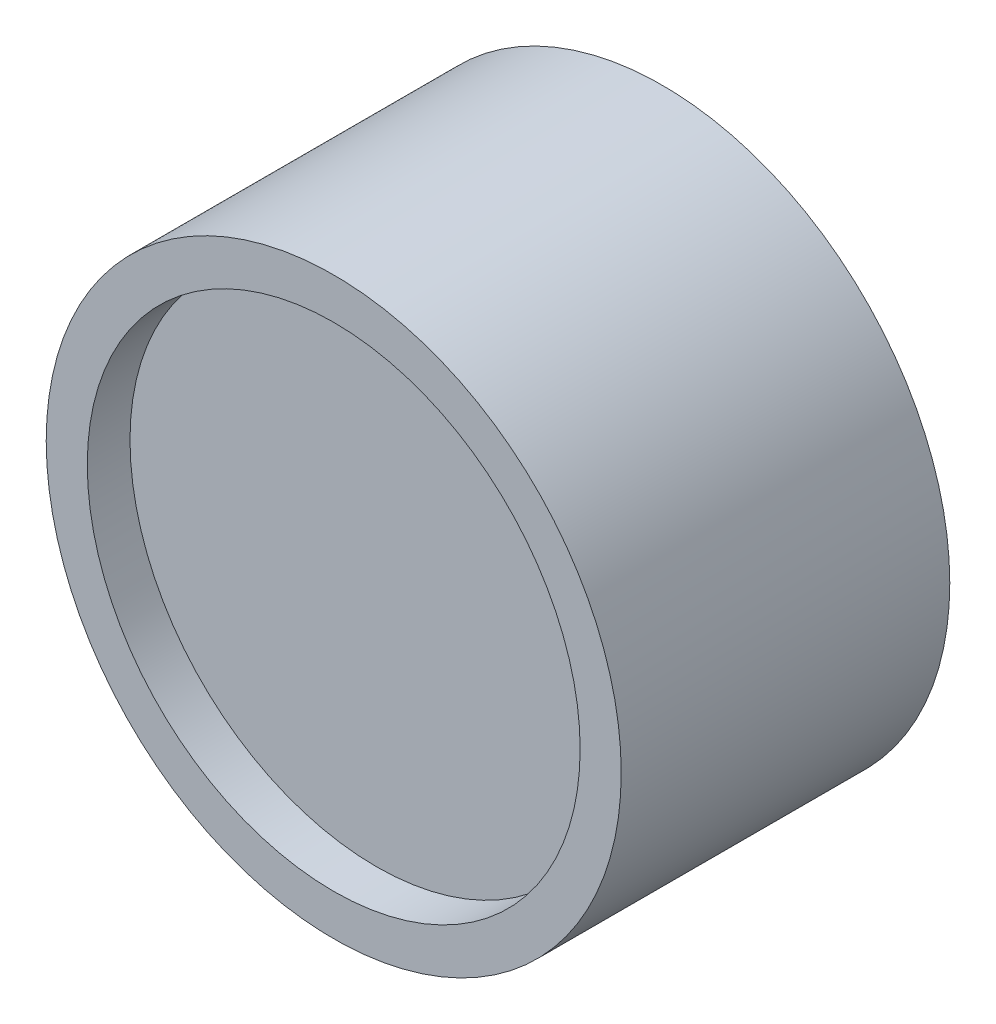
ISO-10303-21;
HEADER;
FILE_DESCRIPTION(('STEP AP214'),'2;1');
FILE_NAME('part.step','',(''),(''),'','','');
FILE_SCHEMA(('AUTOMOTIVE_DESIGN { 1 0 10303 214 1 1 1 1 }'));
ENDSEC;
DATA;
#1=APPLICATION_CONTEXT('core data for automotive mechanical design processes');
#2=APPLICATION_PROTOCOL_DEFINITION('international standard','automotive_design',2000,#1);
#3=PRODUCT_CONTEXT('',#1,'mechanical');
#4=PRODUCT('Part','Part','',(#3));
#5=PRODUCT_RELATED_PRODUCT_CATEGORY('part','',(#4));
#6=PRODUCT_DEFINITION_FORMATION('','',#4);
#7=PRODUCT_DEFINITION_CONTEXT('part definition',#1,'design');
#8=PRODUCT_DEFINITION('design','',#6,#7);
#9=PRODUCT_DEFINITION_SHAPE('','',#8);
#10=(LENGTH_UNIT() NAMED_UNIT(*) SI_UNIT(.MILLI.,.METRE.));
#11=(NAMED_UNIT(*) PLANE_ANGLE_UNIT() SI_UNIT($,.RADIAN.));
#12=(NAMED_UNIT(*) SI_UNIT($,.STERADIAN.) SOLID_ANGLE_UNIT());
#13=UNCERTAINTY_MEASURE_WITH_UNIT(LENGTH_MEASURE(1.E-05),#10,'distance_accuracy_value','');
#14=(GEOMETRIC_REPRESENTATION_CONTEXT(3) GLOBAL_UNCERTAINTY_ASSIGNED_CONTEXT((#13)) GLOBAL_UNIT_ASSIGNED_CONTEXT((#10,
#11,#12)) REPRESENTATION_CONTEXT('',''));
#15=CARTESIAN_POINT('',(0.,0.,0.));
#16=DIRECTION('',(0.,0.,1.));
#17=DIRECTION('',(1.,0.,0.));
#18=AXIS2_PLACEMENT_3D('',#15,#16,#17);
#19=CARTESIAN_POINT('',(0.,0.,25.4));
#20=DIRECTION('',(0.,0.,-1.));
#21=DIRECTION('',(-1.,0.,0.));
#22=AXIS2_PLACEMENT_3D('',#19,#20,#21);
#23=CYLINDRICAL_SURFACE('',#22,22.225);
#24=CARTESIAN_POINT('',(0.,-22.225,11.1125));
#25=CARTESIAN_POINT('',(-0.0890487798453095,-22.2249992505102,11.1125039073543));
#26=CARTESIAN_POINT('',(-0.178159230469294,-22.2244590967661,11.1200178035833));
#27=CARTESIAN_POINT('',(-0.353917635489171,-22.2223562476493,11.1498832780774));
#28=CARTESIAN_POINT('',(-0.440562633778052,-22.2207923746226,11.1722519452273));
#29=CARTESIAN_POINT('',(-0.608818958371995,-22.2168189279091,11.2311794705406));
#30=CARTESIAN_POINT('',(-0.690432988297744,-22.2144098131927,11.2677306286791));
#31=CARTESIAN_POINT('',(-0.846346733612161,-22.209016530152,11.3539725754268));
#32=CARTESIAN_POINT('',(-0.92064807541319,-22.2060324901352,11.4036604332036));
#33=CARTESIAN_POINT('',(-1.05998999170469,-22.1998181704503,11.5148686586035));
#34=CARTESIAN_POINT('',(-1.12501469630088,-22.1965874829864,11.576408889821));
#35=CARTESIAN_POINT('',(-1.24382158914945,-22.1902474420535,11.7095334825911));
#36=CARTESIAN_POINT('',(-1.29760329834655,-22.1871380937593,11.7811182719174));
#37=CARTESIAN_POINT('',(-1.39244884206195,-22.1813881326419,11.9323929227927));
#38=CARTESIAN_POINT('',(-1.4334991146123,-22.1787480209346,12.0120913080482));
#39=CARTESIAN_POINT('',(-1.50162982074141,-22.1742396816116,12.1772712016783));
#40=CARTESIAN_POINT('',(-1.52871044238853,-22.1723714436044,12.2627526321803));
#41=CARTESIAN_POINT('',(-1.56808808720031,-22.1696215072539,12.4369160956109));
#42=CARTESIAN_POINT('',(-1.5804104784373,-22.1687381162285,12.5255923657623));
#43=CARTESIAN_POINT('',(-1.59000021081584,-22.1680524315257,12.7037586920349));
#44=CARTESIAN_POINT('',(-1.58726776650483,-22.1682501224418,12.7932487365407));
#45=CARTESIAN_POINT('',(-1.56684640404739,-22.1697027374792,12.9703290753081));
#46=CARTESIAN_POINT('',(-1.54918498269757,-22.1709557179102,13.0579225587361));
#47=CARTESIAN_POINT('',(-1.49944968680589,-22.1743746638034,13.2288985347794));
#48=CARTESIAN_POINT('',(-1.46737570439987,-22.1765406360985,13.312280995874));
#49=CARTESIAN_POINT('',(-1.38969470144194,-22.1815437306027,13.4725560714156));
#50=CARTESIAN_POINT('',(-1.34407526138189,-22.1843814682512,13.5494426464724));
#51=CARTESIAN_POINT('',(-1.24060729011335,-22.1904077269116,13.694477391925));
#52=CARTESIAN_POINT('',(-1.18275857799096,-22.1935962531125,13.7626254330231));
#53=CARTESIAN_POINT('',(-1.0563195629451,-22.1999734282712,13.888408577817));
#54=CARTESIAN_POINT('',(-0.987705473474702,-22.2031620614841,13.9460197744466));
#55=CARTESIAN_POINT('',(-0.841766632911357,-22.2091732949878,14.0489092827639));
#56=CARTESIAN_POINT('',(-0.764441877818134,-22.2119958951105,14.0941875887878));
#57=CARTESIAN_POINT('',(-0.60326175991087,-22.2169573533996,14.1711242196128));
#58=CARTESIAN_POINT('',(-0.51940593447263,-22.2190961630752,14.2027815785446));
#59=CARTESIAN_POINT('',(-0.347550767268375,-22.2224484329266,14.2515614076498));
#60=CARTESIAN_POINT('',(-0.259551488702717,-22.2236619072117,14.2686840994457));
#61=CARTESIAN_POINT('',(-0.0821147353008575,-22.225024960202,14.2878787828138));
#62=CARTESIAN_POINT('',(0.00731914806021066,-22.2251768744895,14.2899838155781));
#63=CARTESIAN_POINT('',(0.185268660784768,-22.2244059124829,14.279169846819));
#64=CARTESIAN_POINT('',(0.273784296409173,-22.2234830435218,14.2662509478017));
#65=CARTESIAN_POINT('',(0.447291156480126,-22.2206678673679,14.225783204566));
#66=CARTESIAN_POINT('',(0.532285948667428,-22.2187765688341,14.1982495810901));
#67=CARTESIAN_POINT('',(0.696448708516854,-22.2142371838267,14.1293494594617));
#68=CARTESIAN_POINT('',(0.7756166079563,-22.211589088494,14.08798279938));
#69=CARTESIAN_POINT('',(0.926029235370731,-22.2058275571246,13.9925071647473));
#70=CARTESIAN_POINT('',(0.997259969190536,-22.2027133211846,13.938376192758));
#71=CARTESIAN_POINT('',(1.12963525884952,-22.1963724429854,13.818940436154));
#72=CARTESIAN_POINT('',(1.19077968566527,-22.1931457992889,13.7536355086244));
#73=CARTESIAN_POINT('',(1.30135918063973,-22.1869369396489,13.6135627265823));
#74=CARTESIAN_POINT('',(1.35077276342894,-22.1839551786465,13.538777887661));
#75=CARTESIAN_POINT('',(1.4363407997941,-22.1785796677168,13.3819531818253));
#76=CARTESIAN_POINT('',(1.47249535528282,-22.1761859132699,13.2999133706808));
#77=CARTESIAN_POINT('',(1.530482072823,-22.1722596801863,13.1309850595532));
#78=CARTESIAN_POINT('',(1.55232761141387,-22.1707263973451,13.0441011706787));
#79=CARTESIAN_POINT('',(1.58111981510363,-22.1686918130773,12.8678873304204));
#80=CARTESIAN_POINT('',(1.58806668223352,-22.1681904976567,12.7785574122223));
#81=CARTESIAN_POINT('',(1.58686226608574,-22.1682767293873,12.6002008281299));
#82=CARTESIAN_POINT('',(1.57874475114552,-22.1688618412033,12.5111739310651));
#83=CARTESIAN_POINT('',(1.54771216948499,-22.1710498314045,12.3357509172224));
#84=CARTESIAN_POINT('',(1.52479707742355,-22.1726527115328,12.2493548049499));
#85=CARTESIAN_POINT('',(1.46482783203581,-22.1766950052155,12.0816419673959));
#86=CARTESIAN_POINT('',(1.42777402040651,-22.1791343985534,12.0003251194167));
#87=CARTESIAN_POINT('',(1.34058334626266,-22.1845748411356,11.8450615877001));
#88=CARTESIAN_POINT('',(1.29044676981647,-22.1875758780985,11.7711147428586));
#89=CARTESIAN_POINT('',(1.17838765718374,-22.1938093700963,11.6325181543705));
#90=CARTESIAN_POINT('',(1.11644038266148,-22.1970423018232,11.5678884341873));
#91=CARTESIAN_POINT('',(0.982557854313681,-22.2033710565751,11.449921103012));
#92=CARTESIAN_POINT('',(0.910620171371237,-22.2064668460125,11.3965862462958));
#93=CARTESIAN_POINT('',(0.758694924433829,-22.2121766171986,11.3026708673656));
#94=CARTESIAN_POINT('',(0.678695608697481,-22.2147898793735,11.2621093309603));
#95=CARTESIAN_POINT('',(0.513060219064312,-22.2192310743367,11.1950445844122));
#96=CARTESIAN_POINT('',(0.427430829765423,-22.2210599197177,11.1685250293154));
#97=CARTESIAN_POINT('',(0.284403979128168,-22.2232507898786,11.1371352868668));
#98=CARTESIAN_POINT('',(0.227929277558056,-22.2239038006581,11.1279091303768));
#99=CARTESIAN_POINT('',(0.114311522402901,-22.2247786459001,11.1155902384111));
#100=CARTESIAN_POINT('',(0.0571684700624521,-22.2250004811653,11.1124974915157));
#101=CARTESIAN_POINT('',(0.,-22.225,11.1125));
#102=B_SPLINE_CURVE_WITH_KNOTS('',3,(#24,#25,#26,#27,#28,#29,#30,#31,#32,#33,#34,#35,#36,#37,
#38,#39,#40,#41,#42,#43,#44,#45,#46,#47,#48,#49,#50,#51,#52,#53,#54,#55,#56,#57,#58,#59,#60,#61,
#62,#63,#64,#65,#66,#67,#68,#69,#70,#71,#72,#73,#74,#75,#76,#77,#78,#79,#80,#81,#82,#83,#84,#85,
#86,#87,#88,#89,#90,#91,#92,#93,#94,#95,#96,#97,#98,#99,#100,#101),.UNSPECIFIED.,.T.,.F.,(4,2,2,
2,2,2,2,2,2,2,2,2,2,2,2,2,2,2,2,2,2,2,2,2,2,2,2,2,2,2,2,2,2,2,2,2,2,2,4),(0.,0.266937629617519,
0.534182876696859,0.801283232291633,1.06832404730501,1.33581635740702,1.60332006282592,
1.87110775144003,2.13889183483148,2.40621495777005,2.67353427107933,2.94036229494988,
3.20719231580491,3.4742677462243,3.74134712790407,4.00902516602321,4.27670332707104,
4.5444004662052,4.81209352345951,5.07919743208779,5.34629951831529,5.6131239709701,
5.87995154717378,6.14724236669452,6.41453660511808,6.68231668736603,6.95009471133462,
7.21762204897354,7.4851457588287,7.75207051143205,8.01899572115042,8.28591448037196,
8.55282740362445,8.82030566186753,9.08784907032427,9.35578828905132,9.62341493539111,
9.79478667487052,9.96615809527449),.UNSPECIFIED.);
#103=CARTESIAN_POINT('',(0.,-22.225,11.1125));
#104=VERTEX_POINT('',#103);
#105=EDGE_CURVE('E11',#104,#104,#102,.T.);
#106=ORIENTED_EDGE('',*,*,#105,.T.);
#107=EDGE_LOOP('',(#106));
#108=FACE_BOUND('',#107,.T.);
#109=CARTESIAN_POINT('',(0.,0.,25.4));
#110=DIRECTION('',(0.,0.,1.));
#111=DIRECTION('',(1.,0.,0.));
#112=AXIS2_PLACEMENT_3D('',#109,#110,#111);
#113=CIRCLE('',#112,22.225);
#114=CARTESIAN_POINT('',(22.225,0.,25.4));
#115=VERTEX_POINT('',#114);
#116=EDGE_CURVE('E53',#115,#115,#113,.T.);
#117=ORIENTED_EDGE('',*,*,#116,.F.);
#118=EDGE_LOOP('',(#117));
#119=FACE_BOUND('',#118,.T.);
#120=CARTESIAN_POINT('',(0.,0.,0.));
#121=DIRECTION('',(0.,0.,1.));
#122=DIRECTION('',(1.,0.,0.));
#123=AXIS2_PLACEMENT_3D('',#120,#121,#122);
#124=CIRCLE('',#123,22.225);
#125=CARTESIAN_POINT('',(22.225,0.,0.));
#126=VERTEX_POINT('',#125);
#127=EDGE_CURVE('E82',#126,#126,#124,.T.);
#128=ORIENTED_EDGE('',*,*,#127,.T.);
#129=EDGE_LOOP('',(#128));
#130=FACE_BOUND('',#129,.T.);
#131=ADVANCED_FACE('F41',(#108,#119,#130),#23,.T.);
#132=CARTESIAN_POINT('',(0.,0.,25.4));
#133=DIRECTION('',(0.,0.,1.));
#134=DIRECTION('',(1.,0.,0.));
#135=AXIS2_PLACEMENT_3D('',#132,#133,#134);
#136=PLANE('',#135);
#137=CARTESIAN_POINT('',(0.,0.,25.4));
#138=DIRECTION('',(0.,0.,1.));
#139=DIRECTION('',(1.,0.,0.));
#140=AXIS2_PLACEMENT_3D('',#137,#138,#139);
#141=CIRCLE('',#140,19.05);
#142=CARTESIAN_POINT('',(19.05,0.,25.4));
#143=VERTEX_POINT('',#142);
#144=EDGE_CURVE('E76',#143,#143,#141,.T.);
#145=ORIENTED_EDGE('',*,*,#144,.F.);
#146=EDGE_LOOP('',(#145));
#147=FACE_BOUND('',#146,.T.);
#148=ORIENTED_EDGE('',*,*,#116,.T.);
#149=EDGE_LOOP('',(#148));
#150=FACE_BOUND('',#149,.T.);
#151=ADVANCED_FACE('F97',(#147,#150),#136,.T.);
#152=CARTESIAN_POINT('',(0.,0.,0.));
#153=DIRECTION('',(0.,0.,1.));
#154=DIRECTION('',(1.,0.,0.));
#155=AXIS2_PLACEMENT_3D('',#152,#153,#154);
#156=PLANE('',#155);
#157=CARTESIAN_POINT('',(0.,0.,0.));
#158=DIRECTION('',(0.,0.,-1.));
#159=DIRECTION('',(-1.,0.,0.));
#160=AXIS2_PLACEMENT_3D('',#157,#158,#159);
#161=CIRCLE('',#160,19.05);
#162=CARTESIAN_POINT('',(-19.05,0.,0.));
#163=VERTEX_POINT('',#162);
#164=EDGE_CURVE('E66',#163,#163,#161,.T.);
#165=ORIENTED_EDGE('',*,*,#164,.F.);
#166=EDGE_LOOP('',(#165));
#167=FACE_BOUND('',#166,.T.);
#168=ORIENTED_EDGE('',*,*,#127,.F.);
#169=EDGE_LOOP('',(#168));
#170=FACE_BOUND('',#169,.T.);
#171=ADVANCED_FACE('F94',(#167,#170),#156,.F.);
#172=CARTESIAN_POINT('',(0.,0.,22.098));
#173=DIRECTION('',(0.,0.,1.));
#174=DIRECTION('',(1.,0.,0.));
#175=AXIS2_PLACEMENT_3D('',#172,#173,#174);
#176=CYLINDRICAL_SURFACE('',#175,19.05);
#177=CARTESIAN_POINT('',(0.,0.,22.098));
#178=DIRECTION('',(0.,0.,1.));
#179=DIRECTION('',(1.,0.,0.));
#180=AXIS2_PLACEMENT_3D('',#177,#178,#179);
#181=CIRCLE('',#180,19.05);
#182=CARTESIAN_POINT('',(19.05,0.,22.098));
#183=VERTEX_POINT('',#182);
#184=EDGE_CURVE('E78',#183,#183,#181,.T.);
#185=CARTESIAN_POINT('',(19.05,0.,22.098));
#186=CARTESIAN_POINT('',(19.05,0.,22.1323958333333));
#187=CARTESIAN_POINT('',(19.05,0.,22.1667916666667));
#188=CARTESIAN_POINT('',(19.05,0.,22.2355833333333));
#189=CARTESIAN_POINT('',(19.05,0.,22.2699791666667));
#190=CARTESIAN_POINT('',(19.05,0.,22.3387708333333));
#191=CARTESIAN_POINT('',(19.05,0.,22.3731666666667));
#192=CARTESIAN_POINT('',(19.05,0.,22.4419583333333));
#193=CARTESIAN_POINT('',(19.05,0.,22.4763541666667));
#194=CARTESIAN_POINT('',(19.05,0.,22.5451458333333));
#195=CARTESIAN_POINT('',(19.05,0.,22.5795416666667));
#196=CARTESIAN_POINT('',(19.05,0.,22.6483333333333));
#197=CARTESIAN_POINT('',(19.05,0.,22.6827291666667));
#198=CARTESIAN_POINT('',(19.05,0.,22.7515208333333));
#199=CARTESIAN_POINT('',(19.05,0.,22.7859166666667));
#200=CARTESIAN_POINT('',(19.05,0.,22.8547083333333));
#201=CARTESIAN_POINT('',(19.05,0.,22.8891041666667));
#202=CARTESIAN_POINT('',(19.05,0.,22.9578958333333));
#203=CARTESIAN_POINT('',(19.05,0.,22.9922916666667));
#204=CARTESIAN_POINT('',(19.05,0.,23.0610833333333));
#205=CARTESIAN_POINT('',(19.05,0.,23.0954791666667));
#206=CARTESIAN_POINT('',(19.05,0.,23.1642708333333));
#207=CARTESIAN_POINT('',(19.05,0.,23.1986666666667));
#208=CARTESIAN_POINT('',(19.05,0.,23.2674583333333));
#209=CARTESIAN_POINT('',(19.05,0.,23.3018541666667));
#210=CARTESIAN_POINT('',(19.05,0.,23.3706458333333));
#211=CARTESIAN_POINT('',(19.05,0.,23.4050416666667));
#212=CARTESIAN_POINT('',(19.05,0.,23.4738333333333));
#213=CARTESIAN_POINT('',(19.05,0.,23.5082291666667));
#214=CARTESIAN_POINT('',(19.05,0.,23.5770208333333));
#215=CARTESIAN_POINT('',(19.05,0.,23.6114166666667));
#216=CARTESIAN_POINT('',(19.05,0.,23.6802083333333));
#217=CARTESIAN_POINT('',(19.05,0.,23.7146041666667));
#218=CARTESIAN_POINT('',(19.05,0.,23.7833958333333));
#219=CARTESIAN_POINT('',(19.05,0.,23.8177916666667));
#220=CARTESIAN_POINT('',(19.05,0.,23.8865833333333));
#221=CARTESIAN_POINT('',(19.05,0.,23.9209791666667));
#222=CARTESIAN_POINT('',(19.05,0.,23.9897708333333));
#223=CARTESIAN_POINT('',(19.05,0.,24.0241666666667));
#224=CARTESIAN_POINT('',(19.05,0.,24.0929583333333));
#225=CARTESIAN_POINT('',(19.05,0.,24.1273541666667));
#226=CARTESIAN_POINT('',(19.05,0.,24.1961458333333));
#227=CARTESIAN_POINT('',(19.05,0.,24.2305416666667));
#228=CARTESIAN_POINT('',(19.05,0.,24.2993333333333));
#229=CARTESIAN_POINT('',(19.05,0.,24.3337291666667));
#230=CARTESIAN_POINT('',(19.05,0.,24.4025208333333));
#231=CARTESIAN_POINT('',(19.05,0.,24.4369166666667));
#232=CARTESIAN_POINT('',(19.05,0.,24.5057083333333));
#233=CARTESIAN_POINT('',(19.05,0.,24.5401041666667));
#234=CARTESIAN_POINT('',(19.05,0.,24.6088958333333));
#235=CARTESIAN_POINT('',(19.05,0.,24.6432916666667));
#236=CARTESIAN_POINT('',(19.05,0.,24.7120833333333));
#237=CARTESIAN_POINT('',(19.05,0.,24.7464791666667));
#238=CARTESIAN_POINT('',(19.05,0.,24.8152708333333));
#239=CARTESIAN_POINT('',(19.05,0.,24.8496666666667));
#240=CARTESIAN_POINT('',(19.05,0.,24.9184583333333));
#241=CARTESIAN_POINT('',(19.05,0.,24.9528541666667));
#242=CARTESIAN_POINT('',(19.05,0.,25.0216458333333));
#243=CARTESIAN_POINT('',(19.05,0.,25.0560416666667));
#244=CARTESIAN_POINT('',(19.05,0.,25.1248333333333));
#245=CARTESIAN_POINT('',(19.05,0.,25.1592291666667));
#246=CARTESIAN_POINT('',(19.05,0.,25.2280208333333));
#247=CARTESIAN_POINT('',(19.05,0.,25.2624166666667));
#248=CARTESIAN_POINT('',(19.05,0.,25.3312083333333));
#249=CARTESIAN_POINT('',(19.05,0.,25.3656041666667));
#250=CARTESIAN_POINT('',(19.05,0.,25.4));
#251=B_SPLINE_CURVE_WITH_KNOTS('',3,(#185,#186,#187,#188,#189,#190,#191,#192,#193,#194,#195,
#196,#197,#198,#199,#200,#201,#202,#203,#204,#205,#206,#207,#208,#209,#210,#211,#212,#213,#214,
#215,#216,#217,#218,#219,#220,#221,#222,#223,#224,#225,#226,#227,#228,#229,#230,#231,#232,#233,
#234,#235,#236,#237,#238,#239,#240,#241,#242,#243,#244,#245,#246,#247,#248,#249,#250),
.UNSPECIFIED.,.F.,.F.,(4,2,2,2,2,2,2,2,2,2,2,2,2,2,2,2,2,2,2,2,2,2,2,2,2,2,2,2,2,2,2,2,4),(0.,
0.103187500000001,0.206375000000002,0.309562500000003,0.41275,0.515937500000001,
0.619125000000002,0.722312500000002,0.8255,0.928687500000001,1.031875,1.1350625,1.23825,
1.3414375,1.444625,1.5478125,1.651,1.7541875,1.857375,1.9605625,2.06375,2.1669375,2.270125,
2.3733125,2.4765,2.5796875,2.682875,2.7860625,2.88925,2.9924375,3.095625,3.1988125,3.302),.UNSPECIFIED.);
#252=EDGE_CURVE('BSEAM96',#183,#143,#251,.T.);
#253=ORIENTED_EDGE('',*,*,#184,.F.);
#254=ORIENTED_EDGE('',*,*,#144,.T.);
#255=ORIENTED_EDGE('',*,*,#252,.T.);
#256=ORIENTED_EDGE('',*,*,#252,.F.);
#257=EDGE_LOOP('',(#253,#255,#254,#256));
#258=FACE_BOUND('',#257,.T.);
#259=ADVANCED_FACE('F96',(#258),#176,.F.);
#260=CARTESIAN_POINT('',(0.,0.,22.098));
#261=DIRECTION('',(0.,0.,1.));
#262=DIRECTION('',(1.,0.,0.));
#263=AXIS2_PLACEMENT_3D('',#260,#261,#262);
#264=PLANE('',#263);
#265=ORIENTED_EDGE('',*,*,#184,.T.);
#266=EDGE_LOOP('',(#265));
#267=FACE_BOUND('',#266,.T.);
#268=ADVANCED_FACE('F103',(#267),#264,.T.);
#269=CARTESIAN_POINT('',(0.,0.,3.302));
#270=DIRECTION('',(0.,0.,-1.));
#271=DIRECTION('',(-1.,0.,0.));
#272=AXIS2_PLACEMENT_3D('',#269,#270,#271);
#273=CYLINDRICAL_SURFACE('',#272,19.05);
#274=CARTESIAN_POINT('',(0.,0.,3.302));
#275=DIRECTION('',(0.,0.,-1.));
#276=DIRECTION('',(-1.,0.,0.));
#277=AXIS2_PLACEMENT_3D('',#274,#275,#276);
#278=CIRCLE('',#277,19.05);
#279=CARTESIAN_POINT('',(-19.05,0.,3.302));
#280=VERTEX_POINT('',#279);
#281=EDGE_CURVE('E71',#280,#280,#278,.T.);
#282=CARTESIAN_POINT('',(-19.05,0.,3.302));
#283=CARTESIAN_POINT('',(-19.05,0.,3.26760416666667));
#284=CARTESIAN_POINT('',(-19.05,0.,3.23320833333333));
#285=CARTESIAN_POINT('',(-19.05,0.,3.16441666666667));
#286=CARTESIAN_POINT('',(-19.05,0.,3.13002083333333));
#287=CARTESIAN_POINT('',(-19.05,0.,3.06122916666667));
#288=CARTESIAN_POINT('',(-19.05,0.,3.02683333333333));
#289=CARTESIAN_POINT('',(-19.05,0.,2.95804166666667));
#290=CARTESIAN_POINT('',(-19.05,0.,2.92364583333333));
#291=CARTESIAN_POINT('',(-19.05,0.,2.85485416666667));
#292=CARTESIAN_POINT('',(-19.05,0.,2.82045833333333));
#293=CARTESIAN_POINT('',(-19.05,0.,2.75166666666667));
#294=CARTESIAN_POINT('',(-19.05,0.,2.71727083333333));
#295=CARTESIAN_POINT('',(-19.05,0.,2.64847916666667));
#296=CARTESIAN_POINT('',(-19.05,0.,2.61408333333333));
#297=CARTESIAN_POINT('',(-19.05,0.,2.54529166666667));
#298=CARTESIAN_POINT('',(-19.05,0.,2.51089583333333));
#299=CARTESIAN_POINT('',(-19.05,0.,2.44210416666667));
#300=CARTESIAN_POINT('',(-19.05,0.,2.40770833333333));
#301=CARTESIAN_POINT('',(-19.05,0.,2.33891666666667));
#302=CARTESIAN_POINT('',(-19.05,0.,2.30452083333333));
#303=CARTESIAN_POINT('',(-19.05,0.,2.23572916666667));
#304=CARTESIAN_POINT('',(-19.05,0.,2.20133333333333));
#305=CARTESIAN_POINT('',(-19.05,0.,2.13254166666667));
#306=CARTESIAN_POINT('',(-19.05,0.,2.09814583333333));
#307=CARTESIAN_POINT('',(-19.05,0.,2.02935416666667));
#308=CARTESIAN_POINT('',(-19.05,0.,1.99495833333333));
#309=CARTESIAN_POINT('',(-19.05,0.,1.92616666666667));
#310=CARTESIAN_POINT('',(-19.05,0.,1.89177083333333));
#311=CARTESIAN_POINT('',(-19.05,0.,1.82297916666667));
#312=CARTESIAN_POINT('',(-19.05,0.,1.78858333333333));
#313=CARTESIAN_POINT('',(-19.05,0.,1.71979166666667));
#314=CARTESIAN_POINT('',(-19.05,0.,1.68539583333333));
#315=CARTESIAN_POINT('',(-19.05,0.,1.61660416666667));
#316=CARTESIAN_POINT('',(-19.05,0.,1.58220833333333));
#317=CARTESIAN_POINT('',(-19.05,0.,1.51341666666667));
#318=CARTESIAN_POINT('',(-19.05,0.,1.47902083333333));
#319=CARTESIAN_POINT('',(-19.05,0.,1.41022916666667));
#320=CARTESIAN_POINT('',(-19.05,0.,1.37583333333333));
#321=CARTESIAN_POINT('',(-19.05,0.,1.30704166666667));
#322=CARTESIAN_POINT('',(-19.05,0.,1.27264583333333));
#323=CARTESIAN_POINT('',(-19.05,0.,1.20385416666667));
#324=CARTESIAN_POINT('',(-19.05,0.,1.16945833333333));
#325=CARTESIAN_POINT('',(-19.05,0.,1.10066666666667));
#326=CARTESIAN_POINT('',(-19.05,0.,1.06627083333333));
#327=CARTESIAN_POINT('',(-19.05,0.,0.997479166666667));
#328=CARTESIAN_POINT('',(-19.05,0.,0.963083333333334));
#329=CARTESIAN_POINT('',(-19.05,0.,0.894291666666667));
#330=CARTESIAN_POINT('',(-19.05,0.,0.859895833333334));
#331=CARTESIAN_POINT('',(-19.05,0.,0.791104166666667));
#332=CARTESIAN_POINT('',(-19.05,0.,0.756708333333334));
#333=CARTESIAN_POINT('',(-19.05,0.,0.687916666666667));
#334=CARTESIAN_POINT('',(-19.05,0.,0.653520833333334));
#335=CARTESIAN_POINT('',(-19.05,0.,0.584729166666667));
#336=CARTESIAN_POINT('',(-19.05,0.,0.550333333333333));
#337=CARTESIAN_POINT('',(-19.05,0.,0.481541666666667));
#338=CARTESIAN_POINT('',(-19.05,0.,0.447145833333333));
#339=CARTESIAN_POINT('',(-19.05,0.,0.378354166666667));
#340=CARTESIAN_POINT('',(-19.05,0.,0.343958333333333));
#341=CARTESIAN_POINT('',(-19.05,0.,0.275166666666667));
#342=CARTESIAN_POINT('',(-19.05,0.,0.240770833333333));
#343=CARTESIAN_POINT('',(-19.05,0.,0.171979166666667));
#344=CARTESIAN_POINT('',(-19.05,0.,0.137583333333333));
#345=CARTESIAN_POINT('',(-19.05,0.,0.0687916666666667));
#346=CARTESIAN_POINT('',(-19.05,0.,0.0343958333333333));
#347=CARTESIAN_POINT('',(-19.05,0.,0.));
#348=B_SPLINE_CURVE_WITH_KNOTS('',3,(#282,#283,#284,#285,#286,#287,#288,#289,#290,#291,#292,
#293,#294,#295,#296,#297,#298,#299,#300,#301,#302,#303,#304,#305,#306,#307,#308,#309,#310,#311,
#312,#313,#314,#315,#316,#317,#318,#319,#320,#321,#322,#323,#324,#325,#326,#327,#328,#329,#330,
#331,#332,#333,#334,#335,#336,#337,#338,#339,#340,#341,#342,#343,#344,#345,#346,#347),
.UNSPECIFIED.,.F.,.F.,(4,2,2,2,2,2,2,2,2,2,2,2,2,2,2,2,2,2,2,2,2,2,2,2,2,2,2,2,2,2,2,2,4),(0.,
0.1031875,0.206375,0.3095625,0.41275,0.5159375,0.619125,0.7223125,0.8255,0.9286875,1.031875,
1.1350625,1.23825,1.3414375,1.444625,1.5478125,1.651,1.7541875,1.857375,1.9605625,2.06375,
2.1669375,2.270125,2.3733125,2.4765,2.5796875,2.682875,2.7860625,2.88925,2.9924375,3.095625,
3.1988125,3.302),.UNSPECIFIED.);
#349=EDGE_CURVE('BSEAM123',#280,#163,#348,.T.);
#350=ORIENTED_EDGE('',*,*,#281,.F.);
#351=ORIENTED_EDGE('',*,*,#164,.T.);
#352=ORIENTED_EDGE('',*,*,#349,.T.);
#353=ORIENTED_EDGE('',*,*,#349,.F.);
#354=EDGE_LOOP('',(#350,#352,#351,#353));
#355=FACE_BOUND('',#354,.T.);
#356=ADVANCED_FACE('F123',(#355),#273,.F.);
#357=CARTESIAN_POINT('',(0.,0.,3.302));
#358=DIRECTION('',(0.,0.,-1.));
#359=DIRECTION('',(-1.,0.,0.));
#360=AXIS2_PLACEMENT_3D('',#357,#358,#359);
#361=PLANE('',#360);
#362=ORIENTED_EDGE('',*,*,#281,.T.);
#363=EDGE_LOOP('',(#362));
#364=FACE_BOUND('',#363,.T.);
#365=ADVANCED_FACE('F119',(#364),#361,.T.);
#366=CARTESIAN_POINT('',(0.,-22.225,12.7));
#367=DIRECTION('',(0.,-1.,0.));
#368=DIRECTION('',(0.,0.,-1.));
#369=AXIS2_PLACEMENT_3D('',#366,#367,#368);
#370=CYLINDRICAL_SURFACE('',#369,1.58749999999999);
#371=CARTESIAN_POINT('',(0.,-6.223,12.7));
#372=DIRECTION('',(0.,-1.,0.));
#373=DIRECTION('',(0.,0.,-1.));
#374=AXIS2_PLACEMENT_3D('',#371,#372,#373);
#375=CIRCLE('',#374,1.5875);
#376=CARTESIAN_POINT('',(0.,-6.223,11.1125));
#377=VERTEX_POINT('',#376);
#378=EDGE_CURVE('E63',#377,#377,#375,.T.);
#379=ORIENTED_EDGE('',*,*,#378,.F.);
#380=EDGE_LOOP('',(#379));
#381=FACE_BOUND('',#380,.T.);
#382=ORIENTED_EDGE('',*,*,#105,.F.);
#383=EDGE_LOOP('',(#382));
#384=FACE_BOUND('',#383,.T.);
#385=ADVANCED_FACE('F59',(#381,#384),#370,.F.);
#386=CARTESIAN_POINT('',(0.,-6.223,12.7));
#387=DIRECTION('',(0.,-1.,0.));
#388=DIRECTION('',(0.,0.,-1.));
#389=AXIS2_PLACEMENT_3D('',#386,#387,#388);
#390=CONICAL_SURFACE('',#389,1.5875,1.02974425867665);
#391=CARTESIAN_POINT('',(0.,-5.26913376729375,12.7));
#392=VERTEX_POINT('',#391);
#393=VERTEX_LOOP('',#392);
#394=FACE_BOUND('',#393,.T.);
#395=ORIENTED_EDGE('',*,*,#378,.T.);
#396=EDGE_LOOP('',(#395));
#397=FACE_BOUND('',#396,.T.);
#398=ADVANCED_FACE('F56',(#394,#397),#390,.F.);
#399=CLOSED_SHELL('',(#131,#151,#171,#259,#268,#356,#365,#385,#398));
#400=MANIFOLD_SOLID_BREP('B2',#399);
#401=ADVANCED_BREP_SHAPE_REPRESENTATION('',(#18,#400),#14);
#402=SHAPE_DEFINITION_REPRESENTATION(#9,#401);
ENDSEC;
END-ISO-10303-21;
